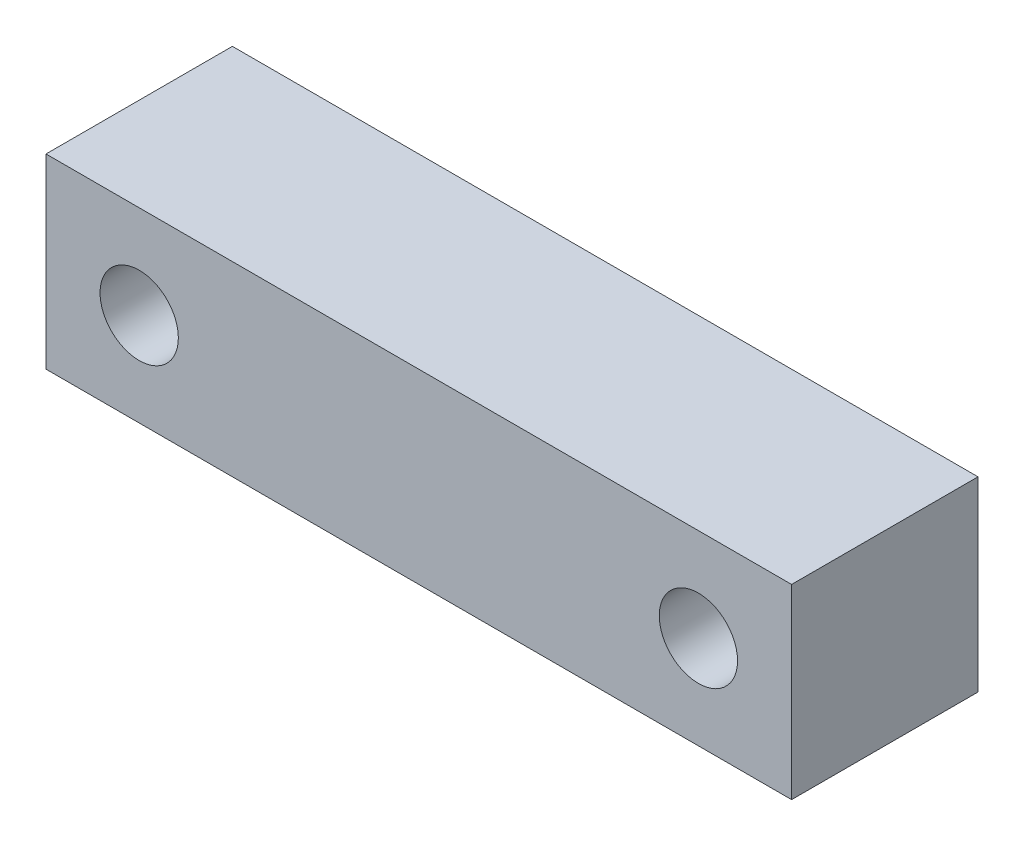
ISO-10303-21;
HEADER;
FILE_DESCRIPTION(('STEP AP214'),'2;1');
FILE_NAME('part.step','',(''),(''),'','','');
FILE_SCHEMA(('AUTOMOTIVE_DESIGN { 1 0 10303 214 1 1 1 1 }'));
ENDSEC;
DATA;
#1=APPLICATION_CONTEXT('core data for automotive mechanical design processes');
#2=APPLICATION_PROTOCOL_DEFINITION('international standard','automotive_design',2000,#1);
#3=PRODUCT_CONTEXT('',#1,'mechanical');
#4=PRODUCT('Part','Part','',(#3));
#5=PRODUCT_RELATED_PRODUCT_CATEGORY('part','',(#4));
#6=PRODUCT_DEFINITION_FORMATION('','',#4);
#7=PRODUCT_DEFINITION_CONTEXT('part definition',#1,'design');
#8=PRODUCT_DEFINITION('design','',#6,#7);
#9=PRODUCT_DEFINITION_SHAPE('','',#8);
#10=(LENGTH_UNIT() NAMED_UNIT(*) SI_UNIT(.MILLI.,.METRE.));
#11=(NAMED_UNIT(*) PLANE_ANGLE_UNIT() SI_UNIT($,.RADIAN.));
#12=(NAMED_UNIT(*) SI_UNIT($,.STERADIAN.) SOLID_ANGLE_UNIT());
#13=UNCERTAINTY_MEASURE_WITH_UNIT(LENGTH_MEASURE(1.E-05),#10,'distance_accuracy_value','');
#14=(GEOMETRIC_REPRESENTATION_CONTEXT(3) GLOBAL_UNCERTAINTY_ASSIGNED_CONTEXT((#13)) GLOBAL_UNIT_ASSIGNED_CONTEXT((#10,
#11,#12)) REPRESENTATION_CONTEXT('',''));
#15=CARTESIAN_POINT('',(0.,0.,0.));
#16=DIRECTION('',(0.,0.,1.));
#17=DIRECTION('',(1.,0.,0.));
#18=AXIS2_PLACEMENT_3D('',#15,#16,#17);
#19=CARTESIAN_POINT('',(0.,0.,10.));
#20=DIRECTION('',(0.,0.,-1.));
#21=DIRECTION('',(-1.,0.,0.));
#22=AXIS2_PLACEMENT_3D('',#19,#20,#21);
#23=PLANE('',#22);
#24=DIRECTION('',(0.,1.,0.));
#25=VECTOR('',#24,1.);
#26=CARTESIAN_POINT('',(20.,-5.,10.));
#27=LINE('',#26,#25);
#28=CARTESIAN_POINT('',(20.,-5.,10.));
#29=VERTEX_POINT('',#28);
#30=CARTESIAN_POINT('',(20.,5.,10.));
#31=VERTEX_POINT('',#30);
#32=EDGE_CURVE('E95',#29,#31,#27,.T.);
#33=ORIENTED_EDGE('',*,*,#32,.T.);
#34=DIRECTION('',(-1.,0.,0.));
#35=VECTOR('',#34,1.);
#36=CARTESIAN_POINT('',(-20.,5.,10.));
#37=LINE('',#36,#35);
#38=CARTESIAN_POINT('',(-20.,5.,10.));
#39=VERTEX_POINT('',#38);
#40=EDGE_CURVE('E90',#31,#39,#37,.T.);
#41=ORIENTED_EDGE('',*,*,#40,.T.);
#42=DIRECTION('',(0.,-1.,0.));
#43=VECTOR('',#42,1.);
#44=CARTESIAN_POINT('',(-20.,-5.,10.));
#45=LINE('',#44,#43);
#46=CARTESIAN_POINT('',(-20.,-5.,10.));
#47=VERTEX_POINT('',#46);
#48=EDGE_CURVE('E93',#39,#47,#45,.T.);
#49=ORIENTED_EDGE('',*,*,#48,.T.);
#50=DIRECTION('',(1.,0.,0.));
#51=VECTOR('',#50,1.);
#52=CARTESIAN_POINT('',(-20.,-5.,10.));
#53=LINE('',#52,#51);
#54=EDGE_CURVE('E60',#47,#29,#53,.T.);
#55=ORIENTED_EDGE('',*,*,#54,.T.);
#56=EDGE_LOOP('',(#33,#41,#49,#55));
#57=FACE_BOUND('',#56,.T.);
#58=CARTESIAN_POINT('',(-15.,0.,10.));
#59=DIRECTION('',(0.,0.,1.));
#60=DIRECTION('',(1.,0.,0.));
#61=AXIS2_PLACEMENT_3D('',#58,#59,#60);
#62=CIRCLE('',#61,2.1);
#63=CARTESIAN_POINT('',(-12.9,0.,10.));
#64=VERTEX_POINT('',#63);
#65=EDGE_CURVE('E110',#64,#64,#62,.T.);
#66=ORIENTED_EDGE('',*,*,#65,.F.);
#67=EDGE_LOOP('',(#66));
#68=FACE_BOUND('',#67,.T.);
#69=CARTESIAN_POINT('',(15.,0.,10.));
#70=DIRECTION('',(0.,0.,1.));
#71=DIRECTION('',(1.,0.,0.));
#72=AXIS2_PLACEMENT_3D('',#69,#70,#71);
#73=CIRCLE('',#72,2.1);
#74=CARTESIAN_POINT('',(17.1,0.,10.));
#75=VERTEX_POINT('',#74);
#76=EDGE_CURVE('E125',#75,#75,#73,.T.);
#77=ORIENTED_EDGE('',*,*,#76,.F.);
#78=EDGE_LOOP('',(#77));
#79=FACE_BOUND('',#78,.T.);
#80=ADVANCED_FACE('F43',(#57,#68,#79),#23,.F.);
#81=CARTESIAN_POINT('',(0.,0.,0.));
#82=DIRECTION('',(0.,0.,-1.));
#83=DIRECTION('',(-1.,0.,0.));
#84=AXIS2_PLACEMENT_3D('',#81,#82,#83);
#85=PLANE('',#84);
#86=CARTESIAN_POINT('',(-15.,0.,0.));
#87=DIRECTION('',(0.,0.,1.));
#88=DIRECTION('',(1.,0.,0.));
#89=AXIS2_PLACEMENT_3D('',#86,#87,#88);
#90=CIRCLE('',#89,2.1);
#91=CARTESIAN_POINT('',(-12.9,0.,0.));
#92=VERTEX_POINT('',#91);
#93=EDGE_CURVE('E122',#92,#92,#90,.T.);
#94=ORIENTED_EDGE('',*,*,#93,.T.);
#95=EDGE_LOOP('',(#94));
#96=FACE_BOUND('',#95,.T.);
#97=DIRECTION('',(0.,1.,0.));
#98=VECTOR('',#97,1.);
#99=CARTESIAN_POINT('',(20.,-5.,0.));
#100=LINE('',#99,#98);
#101=CARTESIAN_POINT('',(20.,-5.,0.));
#102=VERTEX_POINT('',#101);
#103=CARTESIAN_POINT('',(20.,5.,0.));
#104=VERTEX_POINT('',#103);
#105=EDGE_CURVE('E107',#102,#104,#100,.T.);
#106=ORIENTED_EDGE('',*,*,#105,.F.);
#107=DIRECTION('',(1.,0.,0.));
#108=VECTOR('',#107,1.);
#109=CARTESIAN_POINT('',(-20.,-5.,0.));
#110=LINE('',#109,#108);
#111=CARTESIAN_POINT('',(-20.,-5.,0.));
#112=VERTEX_POINT('',#111);
#113=EDGE_CURVE('E83',#112,#102,#110,.T.);
#114=ORIENTED_EDGE('',*,*,#113,.F.);
#115=DIRECTION('',(0.,-1.,0.));
#116=VECTOR('',#115,1.);
#117=CARTESIAN_POINT('',(-20.,-5.,0.));
#118=LINE('',#117,#116);
#119=CARTESIAN_POINT('',(-20.,5.,0.));
#120=VERTEX_POINT('',#119);
#121=EDGE_CURVE('E77',#120,#112,#118,.T.);
#122=ORIENTED_EDGE('',*,*,#121,.F.);
#123=DIRECTION('',(-1.,0.,0.));
#124=VECTOR('',#123,1.);
#125=CARTESIAN_POINT('',(-20.,5.,0.));
#126=LINE('',#125,#124);
#127=EDGE_CURVE('E99',#104,#120,#126,.T.);
#128=ORIENTED_EDGE('',*,*,#127,.F.);
#129=EDGE_LOOP('',(#106,#114,#122,#128));
#130=FACE_BOUND('',#129,.T.);
#131=CARTESIAN_POINT('',(15.,0.,0.));
#132=DIRECTION('',(0.,0.,1.));
#133=DIRECTION('',(1.,0.,0.));
#134=AXIS2_PLACEMENT_3D('',#131,#132,#133);
#135=CIRCLE('',#134,2.1);
#136=CARTESIAN_POINT('',(17.1,0.,0.));
#137=VERTEX_POINT('',#136);
#138=EDGE_CURVE('E128',#137,#137,#135,.T.);
#139=ORIENTED_EDGE('',*,*,#138,.T.);
#140=EDGE_LOOP('',(#139));
#141=FACE_BOUND('',#140,.T.);
#142=ADVANCED_FACE('F118',(#96,#130,#141),#85,.T.);
#143=CARTESIAN_POINT('',(20.,-5.,10.));
#144=DIRECTION('',(-1.,0.,0.));
#145=DIRECTION('',(0.,0.,1.));
#146=AXIS2_PLACEMENT_3D('',#143,#144,#145);
#147=PLANE('',#146);
#148=ORIENTED_EDGE('',*,*,#105,.T.);
#149=DIRECTION('',(0.,0.,-1.));
#150=VECTOR('',#149,1.);
#151=CARTESIAN_POINT('',(20.,5.,10.));
#152=LINE('',#151,#150);
#153=EDGE_CURVE('E13',#31,#104,#152,.T.);
#154=ORIENTED_EDGE('',*,*,#153,.F.);
#155=ORIENTED_EDGE('',*,*,#32,.F.);
#156=DIRECTION('',(0.,0.,-1.));
#157=VECTOR('',#156,1.);
#158=CARTESIAN_POINT('',(20.,-5.,10.));
#159=LINE('',#158,#157);
#160=EDGE_CURVE('E103',#29,#102,#159,.T.);
#161=ORIENTED_EDGE('',*,*,#160,.T.);
#162=EDGE_LOOP('',(#148,#154,#155,#161));
#163=FACE_BOUND('',#162,.T.);
#164=ADVANCED_FACE('F45',(#163),#147,.F.);
#165=CARTESIAN_POINT('',(-20.,5.,10.));
#166=DIRECTION('',(0.,-1.,0.));
#167=DIRECTION('',(0.,0.,-1.));
#168=AXIS2_PLACEMENT_3D('',#165,#166,#167);
#169=PLANE('',#168);
#170=ORIENTED_EDGE('',*,*,#127,.T.);
#171=DIRECTION('',(0.,0.,-1.));
#172=VECTOR('',#171,1.);
#173=CARTESIAN_POINT('',(-20.,5.,10.));
#174=LINE('',#173,#172);
#175=EDGE_CURVE('E52',#39,#120,#174,.T.);
#176=ORIENTED_EDGE('',*,*,#175,.F.);
#177=ORIENTED_EDGE('',*,*,#40,.F.);
#178=ORIENTED_EDGE('',*,*,#153,.T.);
#179=EDGE_LOOP('',(#170,#176,#177,#178));
#180=FACE_BOUND('',#179,.T.);
#181=ADVANCED_FACE('F98',(#180),#169,.F.);
#182=CARTESIAN_POINT('',(-20.,-5.,10.));
#183=DIRECTION('',(1.,0.,0.));
#184=DIRECTION('',(0.,0.,-1.));
#185=AXIS2_PLACEMENT_3D('',#182,#183,#184);
#186=PLANE('',#185);
#187=ORIENTED_EDGE('',*,*,#121,.T.);
#188=DIRECTION('',(0.,0.,-1.));
#189=VECTOR('',#188,1.);
#190=CARTESIAN_POINT('',(-20.,-5.,10.));
#191=LINE('',#190,#189);
#192=EDGE_CURVE('E100',#47,#112,#191,.T.);
#193=ORIENTED_EDGE('',*,*,#192,.F.);
#194=ORIENTED_EDGE('',*,*,#48,.F.);
#195=ORIENTED_EDGE('',*,*,#175,.T.);
#196=EDGE_LOOP('',(#187,#193,#194,#195));
#197=FACE_BOUND('',#196,.T.);
#198=ADVANCED_FACE('F101',(#197),#186,.F.);
#199=CARTESIAN_POINT('',(-20.,-5.,10.));
#200=DIRECTION('',(0.,1.,0.));
#201=DIRECTION('',(0.,0.,1.));
#202=AXIS2_PLACEMENT_3D('',#199,#200,#201);
#203=PLANE('',#202);
#204=ORIENTED_EDGE('',*,*,#113,.T.);
#205=ORIENTED_EDGE('',*,*,#160,.F.);
#206=ORIENTED_EDGE('',*,*,#54,.F.);
#207=ORIENTED_EDGE('',*,*,#192,.T.);
#208=EDGE_LOOP('',(#204,#205,#206,#207));
#209=FACE_BOUND('',#208,.T.);
#210=ADVANCED_FACE('F115',(#209),#203,.F.);
#211=CARTESIAN_POINT('',(-15.,0.,10.));
#212=DIRECTION('',(0.,0.,-1.));
#213=DIRECTION('',(-1.,0.,0.));
#214=AXIS2_PLACEMENT_3D('',#211,#212,#213);
#215=CYLINDRICAL_SURFACE('',#214,2.1);
#216=ORIENTED_EDGE('',*,*,#65,.T.);
#217=EDGE_LOOP('',(#216));
#218=FACE_BOUND('',#217,.T.);
#219=ORIENTED_EDGE('',*,*,#93,.F.);
#220=EDGE_LOOP('',(#219));
#221=FACE_BOUND('',#220,.T.);
#222=ADVANCED_FACE('F145',(#218,#221),#215,.F.);
#223=CARTESIAN_POINT('',(15.,0.,10.));
#224=DIRECTION('',(0.,0.,-1.));
#225=DIRECTION('',(-1.,0.,0.));
#226=AXIS2_PLACEMENT_3D('',#223,#224,#225);
#227=CYLINDRICAL_SURFACE('',#226,2.1);
#228=ORIENTED_EDGE('',*,*,#76,.T.);
#229=EDGE_LOOP('',(#228));
#230=FACE_BOUND('',#229,.T.);
#231=ORIENTED_EDGE('',*,*,#138,.F.);
#232=EDGE_LOOP('',(#231));
#233=FACE_BOUND('',#232,.T.);
#234=ADVANCED_FACE('F134',(#230,#233),#227,.F.);
#235=CLOSED_SHELL('',(#80,#142,#164,#181,#198,#210,#222,#234));
#236=MANIFOLD_SOLID_BREP('B2',#235);
#237=ADVANCED_BREP_SHAPE_REPRESENTATION('',(#18,#236),#14);
#238=SHAPE_DEFINITION_REPRESENTATION(#9,#237);
ENDSEC;
END-ISO-10303-21;
